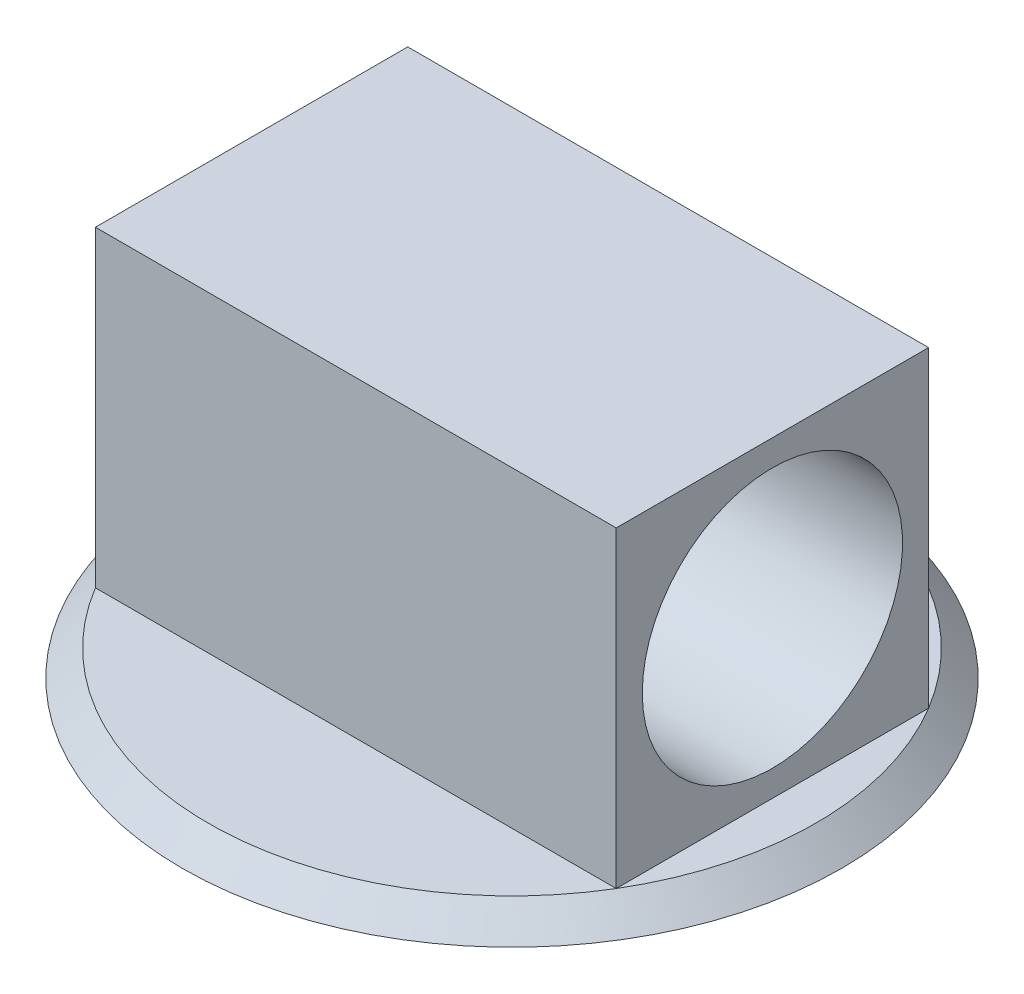
ISO-10303-21;
HEADER;
FILE_DESCRIPTION(('STEP AP214'),'2;1');
FILE_NAME('part.step','',(''),(''),'','','');
FILE_SCHEMA(('AUTOMOTIVE_DESIGN { 1 0 10303 214 1 1 1 1 }'));
ENDSEC;
DATA;
#1=APPLICATION_CONTEXT('core data for automotive mechanical design processes');
#2=APPLICATION_PROTOCOL_DEFINITION('international standard','automotive_design',2000,#1);
#3=PRODUCT_CONTEXT('',#1,'mechanical');
#4=PRODUCT('Part','Part','',(#3));
#5=PRODUCT_RELATED_PRODUCT_CATEGORY('part','',(#4));
#6=PRODUCT_DEFINITION_FORMATION('','',#4);
#7=PRODUCT_DEFINITION_CONTEXT('part definition',#1,'design');
#8=PRODUCT_DEFINITION('design','',#6,#7);
#9=PRODUCT_DEFINITION_SHAPE('','',#8);
#10=(LENGTH_UNIT() NAMED_UNIT(*) SI_UNIT(.MILLI.,.METRE.));
#11=(NAMED_UNIT(*) PLANE_ANGLE_UNIT() SI_UNIT($,.RADIAN.));
#12=(NAMED_UNIT(*) SI_UNIT($,.STERADIAN.) SOLID_ANGLE_UNIT());
#13=UNCERTAINTY_MEASURE_WITH_UNIT(LENGTH_MEASURE(1.E-05),#10,'distance_accuracy_value','');
#14=(GEOMETRIC_REPRESENTATION_CONTEXT(3) GLOBAL_UNCERTAINTY_ASSIGNED_CONTEXT((#13)) GLOBAL_UNIT_ASSIGNED_CONTEXT((#10,
#11,#12)) REPRESENTATION_CONTEXT('',''));
#15=CARTESIAN_POINT('',(0.,0.,0.));
#16=DIRECTION('',(0.,0.,1.));
#17=DIRECTION('',(1.,0.,0.));
#18=AXIS2_PLACEMENT_3D('',#15,#16,#17);
#19=CARTESIAN_POINT('',(0.,1.5,-8.));
#20=DIRECTION('',(0.,1.,0.));
#21=DIRECTION('',(0.,0.,1.));
#22=AXIS2_PLACEMENT_3D('',#19,#20,#21);
#23=PLANE('',#22);
#24=DIRECTION('',(0.,0.,1.));
#25=VECTOR('',#24,1.);
#26=CARTESIAN_POINT('',(-15.0083310198036,1.5,0.999999999999997));
#27=LINE('',#26,#25);
#28=CARTESIAN_POINT('',(-15.0083310198036,1.5,-17.));
#29=VERTEX_POINT('',#28);
#30=CARTESIAN_POINT('',(-15.0083310198036,1.5,0.999999999999997));
#31=VERTEX_POINT('',#30);
#32=EDGE_CURVE('E62',#29,#31,#27,.T.);
#33=ORIENTED_EDGE('',*,*,#32,.F.);
#34=CARTESIAN_POINT('',(0.,1.5,-8.));
#35=DIRECTION('',(0.,1.,0.));
#36=DIRECTION('',(0.,0.,1.));
#37=AXIS2_PLACEMENT_3D('',#34,#35,#36);
#38=CIRCLE('',#37,17.5);
#39=EDGE_CURVE('E113',#29,#31,#38,.T.);
#40=ORIENTED_EDGE('',*,*,#39,.T.);
#41=EDGE_LOOP('',(#33,#40));
#42=FACE_BOUND('',#41,.T.);
#43=ADVANCED_FACE('F39',(#42),#23,.T.);
#44=DIRECTION('',(-1.,0.,0.));
#45=VECTOR('',#44,1.);
#46=CARTESIAN_POINT('',(-15.0083310198036,1.5,-17.));
#47=LINE('',#46,#45);
#48=CARTESIAN_POINT('',(15.0083310198036,1.5,-16.9999999999999));
#49=VERTEX_POINT('',#48);
#50=EDGE_CURVE('E105',#49,#29,#47,.T.);
#51=ORIENTED_EDGE('',*,*,#50,.F.);
#52=EDGE_CURVE('E120',#49,#29,#38,.T.);
#53=ORIENTED_EDGE('',*,*,#52,.T.);
#54=EDGE_LOOP('',(#51,#53));
#55=FACE_BOUND('',#54,.T.);
#56=ADVANCED_FACE('F156',(#55),#23,.T.);
#57=DIRECTION('',(0.,0.,-1.));
#58=VECTOR('',#57,1.);
#59=CARTESIAN_POINT('',(15.0083310198036,1.5,0.999999999999997));
#60=LINE('',#59,#58);
#61=CARTESIAN_POINT('',(15.0083310198036,1.5,0.999999999999997));
#62=VERTEX_POINT('',#61);
#63=EDGE_CURVE('E132',#62,#49,#60,.T.);
#64=ORIENTED_EDGE('',*,*,#63,.F.);
#65=EDGE_CURVE('E49',#62,#49,#38,.T.);
#66=ORIENTED_EDGE('',*,*,#65,.T.);
#67=EDGE_LOOP('',(#64,#66));
#68=FACE_BOUND('',#67,.T.);
#69=ADVANCED_FACE('F133',(#68),#23,.T.);
#70=DIRECTION('',(1.,0.,0.));
#71=VECTOR('',#70,1.);
#72=CARTESIAN_POINT('',(-15.0083310198036,1.5,0.999999999999997));
#73=LINE('',#72,#71);
#74=EDGE_CURVE('E55',#31,#62,#73,.T.);
#75=ORIENTED_EDGE('',*,*,#74,.F.);
#76=EDGE_CURVE('E109',#31,#62,#38,.T.);
#77=ORIENTED_EDGE('',*,*,#76,.T.);
#78=EDGE_LOOP('',(#75,#77));
#79=FACE_BOUND('',#78,.T.);
#80=ADVANCED_FACE('F131',(#79),#23,.T.);
#81=CARTESIAN_POINT('',(0.,0.,-8.));
#82=DIRECTION('',(0.,1.,0.));
#83=DIRECTION('',(0.,0.,1.));
#84=AXIS2_PLACEMENT_3D('',#81,#82,#83);
#85=PLANE('',#84);
#86=CARTESIAN_POINT('',(0.,0.,-8.));
#87=DIRECTION('',(0.,1.,0.));
#88=DIRECTION('',(0.,0.,1.));
#89=AXIS2_PLACEMENT_3D('',#86,#87,#88);
#90=CIRCLE('',#89,19.);
#91=CARTESIAN_POINT('',(0.,0.,11.));
#92=VERTEX_POINT('',#91);
#93=EDGE_CURVE('E11',#92,#92,#90,.F.);
#94=ORIENTED_EDGE('',*,*,#93,.T.);
#95=EDGE_LOOP('',(#94));
#96=FACE_BOUND('',#95,.T.);
#97=ADVANCED_FACE('F165',(#96),#85,.F.);
#98=CARTESIAN_POINT('',(0.,1.5,-8.));
#99=DIRECTION('',(0.,-1.,0.));
#100=DIRECTION('',(0.,0.,-1.));
#101=AXIS2_PLACEMENT_3D('',#98,#99,#100);
#102=CONICAL_SURFACE('',#101,17.5,0.785398163397453);
#103=ORIENTED_EDGE('',*,*,#93,.F.);
#104=EDGE_LOOP('',(#103));
#105=FACE_BOUND('',#104,.T.);
#106=ORIENTED_EDGE('',*,*,#65,.F.);
#107=ORIENTED_EDGE('',*,*,#76,.F.);
#108=ORIENTED_EDGE('',*,*,#39,.F.);
#109=ORIENTED_EDGE('',*,*,#52,.F.);
#110=EDGE_LOOP('',(#106,#107,#108,#109));
#111=FACE_BOUND('',#110,.T.);
#112=ADVANCED_FACE('F41',(#105,#111),#102,.T.);
#113=CARTESIAN_POINT('',(-15.0083310198036,19.5,0.999999999999997));
#114=DIRECTION('',(1.,0.,0.));
#115=DIRECTION('',(0.,0.,-1.));
#116=AXIS2_PLACEMENT_3D('',#113,#114,#115);
#117=PLANE('',#116);
#118=CARTESIAN_POINT('',(-15.0083310198036,10.5,-8.));
#119=DIRECTION('',(-1.,0.,0.));
#120=DIRECTION('',(0.,0.,1.));
#121=AXIS2_PLACEMENT_3D('',#118,#119,#120);
#122=CIRCLE('',#121,7.5);
#123=CARTESIAN_POINT('',(-15.0083310198036,10.5,-0.500000000000002));
#124=VERTEX_POINT('',#123);
#125=EDGE_CURVE('E183',#124,#124,#122,.T.);
#126=ORIENTED_EDGE('',*,*,#125,.F.);
#127=EDGE_LOOP('',(#126));
#128=FACE_BOUND('',#127,.T.);
#129=ORIENTED_EDGE('',*,*,#32,.T.);
#130=DIRECTION('',(0.,-1.,0.));
#131=VECTOR('',#130,1.);
#132=CARTESIAN_POINT('',(-15.0083310198036,19.5,0.999999999999997));
#133=LINE('',#132,#131);
#134=CARTESIAN_POINT('',(-15.0083310198036,19.5,0.999999999999997));
#135=VERTEX_POINT('',#134);
#136=EDGE_CURVE('E88',#135,#31,#133,.T.);
#137=ORIENTED_EDGE('',*,*,#136,.F.);
#138=DIRECTION('',(0.,0.,1.));
#139=VECTOR('',#138,1.);
#140=CARTESIAN_POINT('',(-15.0083310198036,19.5,0.999999999999997));
#141=LINE('',#140,#139);
#142=CARTESIAN_POINT('',(-15.0083310198036,19.5,-17.));
#143=VERTEX_POINT('',#142);
#144=EDGE_CURVE('E95',#143,#135,#141,.T.);
#145=ORIENTED_EDGE('',*,*,#144,.F.);
#146=DIRECTION('',(0.,-1.,0.));
#147=VECTOR('',#146,1.);
#148=CARTESIAN_POINT('',(-15.0083310198036,19.5,-17.));
#149=LINE('',#148,#147);
#150=EDGE_CURVE('E145',#143,#29,#149,.T.);
#151=ORIENTED_EDGE('',*,*,#150,.T.);
#152=EDGE_LOOP('',(#129,#137,#145,#151));
#153=FACE_BOUND('',#152,.T.);
#154=ADVANCED_FACE('F107',(#128,#153),#117,.F.);
#155=CARTESIAN_POINT('',(-15.0083310198036,19.5,0.999999999999997));
#156=DIRECTION('',(0.,0.,-1.));
#157=DIRECTION('',(-1.,0.,0.));
#158=AXIS2_PLACEMENT_3D('',#155,#156,#157);
#159=PLANE('',#158);
#160=ORIENTED_EDGE('',*,*,#74,.T.);
#161=DIRECTION('',(0.,-1.,0.));
#162=VECTOR('',#161,1.);
#163=CARTESIAN_POINT('',(15.0083310198036,19.5,0.999999999999997));
#164=LINE('',#163,#162);
#165=CARTESIAN_POINT('',(15.0083310198036,19.5,0.999999999999997));
#166=VERTEX_POINT('',#165);
#167=EDGE_CURVE('E90',#166,#62,#164,.T.);
#168=ORIENTED_EDGE('',*,*,#167,.F.);
#169=DIRECTION('',(1.,0.,0.));
#170=VECTOR('',#169,1.);
#171=CARTESIAN_POINT('',(-15.0083310198036,19.5,0.999999999999997));
#172=LINE('',#171,#170);
#173=EDGE_CURVE('E84',#135,#166,#172,.T.);
#174=ORIENTED_EDGE('',*,*,#173,.F.);
#175=ORIENTED_EDGE('',*,*,#136,.T.);
#176=EDGE_LOOP('',(#160,#168,#174,#175));
#177=FACE_BOUND('',#176,.T.);
#178=ADVANCED_FACE('F86',(#177),#159,.F.);
#179=CARTESIAN_POINT('',(15.0083310198036,19.5,0.999999999999997));
#180=DIRECTION('',(-1.,0.,0.));
#181=DIRECTION('',(0.,0.,1.));
#182=AXIS2_PLACEMENT_3D('',#179,#180,#181);
#183=PLANE('',#182);
#184=CARTESIAN_POINT('',(15.0083310198036,10.5,-8.));
#185=DIRECTION('',(-1.,0.,0.));
#186=DIRECTION('',(0.,0.,1.));
#187=AXIS2_PLACEMENT_3D('',#184,#185,#186);
#188=CIRCLE('',#187,7.5);
#189=CARTESIAN_POINT('',(15.0083310198036,10.5,-0.500000000000002));
#190=VERTEX_POINT('',#189);
#191=EDGE_CURVE('E43',#190,#190,#188,.T.);
#192=ORIENTED_EDGE('',*,*,#191,.T.);
#193=EDGE_LOOP('',(#192));
#194=FACE_BOUND('',#193,.T.);
#195=ORIENTED_EDGE('',*,*,#63,.T.);
#196=DIRECTION('',(0.,-1.,0.));
#197=VECTOR('',#196,1.);
#198=CARTESIAN_POINT('',(15.0083310198036,19.5,-17.));
#199=LINE('',#198,#197);
#200=CARTESIAN_POINT('',(15.0083310198036,19.5,-17.));
#201=VERTEX_POINT('',#200);
#202=EDGE_CURVE('E115',#201,#49,#199,.T.);
#203=ORIENTED_EDGE('',*,*,#202,.F.);
#204=DIRECTION('',(0.,0.,-1.));
#205=VECTOR('',#204,1.);
#206=CARTESIAN_POINT('',(15.0083310198036,19.5,0.999999999999997));
#207=LINE('',#206,#205);
#208=EDGE_CURVE('E94',#166,#201,#207,.T.);
#209=ORIENTED_EDGE('',*,*,#208,.F.);
#210=ORIENTED_EDGE('',*,*,#167,.T.);
#211=EDGE_LOOP('',(#195,#203,#209,#210));
#212=FACE_BOUND('',#211,.T.);
#213=ADVANCED_FACE('F141',(#194,#212),#183,.F.);
#214=CARTESIAN_POINT('',(-15.0083310198036,19.5,-17.));
#215=DIRECTION('',(0.,0.,1.));
#216=DIRECTION('',(1.,0.,0.));
#217=AXIS2_PLACEMENT_3D('',#214,#215,#216);
#218=PLANE('',#217);
#219=ORIENTED_EDGE('',*,*,#50,.T.);
#220=ORIENTED_EDGE('',*,*,#150,.F.);
#221=DIRECTION('',(-1.,0.,0.));
#222=VECTOR('',#221,1.);
#223=CARTESIAN_POINT('',(-15.0083310198036,19.5,-17.));
#224=LINE('',#223,#222);
#225=EDGE_CURVE('E100',#201,#143,#224,.T.);
#226=ORIENTED_EDGE('',*,*,#225,.F.);
#227=ORIENTED_EDGE('',*,*,#202,.T.);
#228=EDGE_LOOP('',(#219,#220,#226,#227));
#229=FACE_BOUND('',#228,.T.);
#230=ADVANCED_FACE('F155',(#229),#218,.F.);
#231=CARTESIAN_POINT('',(0.,19.5,0.));
#232=DIRECTION('',(0.,-1.,0.));
#233=DIRECTION('',(0.,0.,-1.));
#234=AXIS2_PLACEMENT_3D('',#231,#232,#233);
#235=PLANE('',#234);
#236=ORIENTED_EDGE('',*,*,#144,.T.);
#237=ORIENTED_EDGE('',*,*,#173,.T.);
#238=ORIENTED_EDGE('',*,*,#208,.T.);
#239=ORIENTED_EDGE('',*,*,#225,.T.);
#240=EDGE_LOOP('',(#236,#237,#238,#239));
#241=FACE_BOUND('',#240,.T.);
#242=ADVANCED_FACE('F98',(#241),#235,.F.);
#243=CARTESIAN_POINT('',(24.9916689801964,10.5,-8.));
#244=DIRECTION('',(-1.,0.,0.));
#245=DIRECTION('',(0.,0.,1.));
#246=AXIS2_PLACEMENT_3D('',#243,#244,#245);
#247=CYLINDRICAL_SURFACE('',#246,7.5);
#248=ORIENTED_EDGE('',*,*,#125,.T.);
#249=EDGE_LOOP('',(#248));
#250=FACE_BOUND('',#249,.T.);
#251=ORIENTED_EDGE('',*,*,#191,.F.);
#252=EDGE_LOOP('',(#251));
#253=FACE_BOUND('',#252,.T.);
#254=ADVANCED_FACE('F192',(#250,#253),#247,.F.);
#255=CLOSED_SHELL('',(#43,#56,#69,#80,#97,#112,#154,#178,#213,#230,#242,#254));
#256=MANIFOLD_SOLID_BREP('B2',#255);
#257=ADVANCED_BREP_SHAPE_REPRESENTATION('',(#18,#256),#14);
#258=SHAPE_DEFINITION_REPRESENTATION(#9,#257);
ENDSEC;
END-ISO-10303-21;
